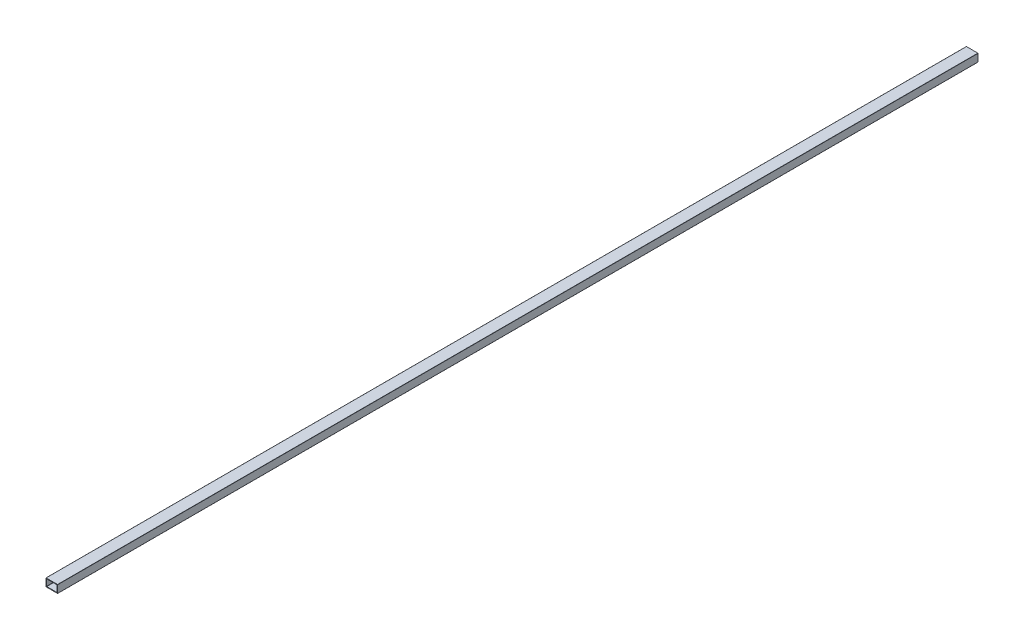
ISO-10303-21;
HEADER;
FILE_DESCRIPTION(('STEP AP214'),'2;1');
FILE_NAME('part.step','',(''),(''),'','','');
FILE_SCHEMA(('AUTOMOTIVE_DESIGN { 1 0 10303 214 1 1 1 1 }'));
ENDSEC;
DATA;
#1=APPLICATION_CONTEXT('core data for automotive mechanical design processes');
#2=APPLICATION_PROTOCOL_DEFINITION('international standard','automotive_design',2000,#1);
#3=PRODUCT_CONTEXT('',#1,'mechanical');
#4=PRODUCT('Part','Part','',(#3));
#5=PRODUCT_RELATED_PRODUCT_CATEGORY('part','',(#4));
#6=PRODUCT_DEFINITION_FORMATION('','',#4);
#7=PRODUCT_DEFINITION_CONTEXT('part definition',#1,'design');
#8=PRODUCT_DEFINITION('design','',#6,#7);
#9=PRODUCT_DEFINITION_SHAPE('','',#8);
#10=(LENGTH_UNIT() NAMED_UNIT(*) SI_UNIT(.MILLI.,.METRE.));
#11=(NAMED_UNIT(*) PLANE_ANGLE_UNIT() SI_UNIT($,.RADIAN.));
#12=(NAMED_UNIT(*) SI_UNIT($,.STERADIAN.) SOLID_ANGLE_UNIT());
#13=UNCERTAINTY_MEASURE_WITH_UNIT(LENGTH_MEASURE(1.E-05),#10,'distance_accuracy_value','');
#14=(GEOMETRIC_REPRESENTATION_CONTEXT(3) GLOBAL_UNCERTAINTY_ASSIGNED_CONTEXT((#13)) GLOBAL_UNIT_ASSIGNED_CONTEXT((#10,
#11,#12)) REPRESENTATION_CONTEXT('',''));
#15=CARTESIAN_POINT('',(0.,0.,0.));
#16=DIRECTION('',(0.,0.,1.));
#17=DIRECTION('',(1.,0.,0.));
#18=AXIS2_PLACEMENT_3D('',#15,#16,#17);
#19=CARTESIAN_POINT('',(38.1,-25.4,-6000.));
#20=DIRECTION('',(1.,0.,0.));
#21=DIRECTION('',(0.,0.,-1.));
#22=AXIS2_PLACEMENT_3D('',#19,#20,#21);
#23=PLANE('',#22);
#24=DIRECTION('',(0.,1.,0.));
#25=VECTOR('',#24,1.);
#26=CARTESIAN_POINT('',(38.1,-25.4,0.));
#27=LINE('',#26,#25);
#28=CARTESIAN_POINT('',(38.1,-24.4,0.));
#29=VERTEX_POINT('',#28);
#30=CARTESIAN_POINT('',(38.1,24.4,0.));
#31=VERTEX_POINT('',#30);
#32=EDGE_CURVE('E197',#29,#31,#27,.T.);
#33=ORIENTED_EDGE('',*,*,#32,.F.);
#34=DIRECTION('',(0.,0.,1.));
#35=VECTOR('',#34,1.);
#36=CARTESIAN_POINT('',(38.1,-24.4,-6000.));
#37=LINE('',#36,#35);
#38=CARTESIAN_POINT('',(38.1,-24.4,-6000.));
#39=VERTEX_POINT('',#38);
#40=EDGE_CURVE('E158',#29,#39,#37,.F.);
#41=ORIENTED_EDGE('',*,*,#40,.T.);
#42=DIRECTION('',(0.,1.,0.));
#43=VECTOR('',#42,1.);
#44=CARTESIAN_POINT('',(38.1,-25.4,-6000.));
#45=LINE('',#44,#43);
#46=CARTESIAN_POINT('',(38.1,24.4,-6000.));
#47=VERTEX_POINT('',#46);
#48=EDGE_CURVE('E185',#39,#47,#45,.T.);
#49=ORIENTED_EDGE('',*,*,#48,.T.);
#50=DIRECTION('',(0.,0.,1.));
#51=VECTOR('',#50,1.);
#52=CARTESIAN_POINT('',(38.1,24.4,-6000.));
#53=LINE('',#52,#51);
#54=EDGE_CURVE('E251',#47,#31,#53,.T.);
#55=ORIENTED_EDGE('',*,*,#54,.T.);
#56=EDGE_LOOP('',(#33,#41,#49,#55));
#57=FACE_BOUND('',#56,.T.);
#58=ADVANCED_FACE('F33',(#57),#23,.T.);
#59=CARTESIAN_POINT('',(-38.1,-25.4,-6000.));
#60=DIRECTION('',(0.,-1.,0.));
#61=DIRECTION('',(0.,0.,-1.));
#62=AXIS2_PLACEMENT_3D('',#59,#60,#61);
#63=PLANE('',#62);
#64=DIRECTION('',(1.,0.,0.));
#65=VECTOR('',#64,1.);
#66=CARTESIAN_POINT('',(-38.1,-25.4,0.));
#67=LINE('',#66,#65);
#68=CARTESIAN_POINT('',(-37.1,-25.4,0.));
#69=VERTEX_POINT('',#68);
#70=CARTESIAN_POINT('',(37.1,-25.4,0.));
#71=VERTEX_POINT('',#70);
#72=EDGE_CURVE('E189',#69,#71,#67,.T.);
#73=ORIENTED_EDGE('',*,*,#72,.F.);
#74=DIRECTION('',(0.,0.,1.));
#75=VECTOR('',#74,1.);
#76=CARTESIAN_POINT('',(-37.1,-25.4,-6000.));
#77=LINE('',#76,#75);
#78=CARTESIAN_POINT('',(-37.1,-25.4,-6000.));
#79=VERTEX_POINT('',#78);
#80=EDGE_CURVE('E238',#69,#79,#77,.F.);
#81=ORIENTED_EDGE('',*,*,#80,.T.);
#82=DIRECTION('',(1.,0.,0.));
#83=VECTOR('',#82,1.);
#84=CARTESIAN_POINT('',(-38.1,-25.4,-6000.));
#85=LINE('',#84,#83);
#86=CARTESIAN_POINT('',(37.1,-25.4,-6000.));
#87=VERTEX_POINT('',#86);
#88=EDGE_CURVE('E194',#79,#87,#85,.T.);
#89=ORIENTED_EDGE('',*,*,#88,.T.);
#90=DIRECTION('',(0.,0.,1.));
#91=VECTOR('',#90,1.);
#92=CARTESIAN_POINT('',(37.1,-25.4,-6000.));
#93=LINE('',#92,#91);
#94=EDGE_CURVE('E235',#87,#71,#93,.T.);
#95=ORIENTED_EDGE('',*,*,#94,.T.);
#96=EDGE_LOOP('',(#73,#81,#89,#95));
#97=FACE_BOUND('',#96,.T.);
#98=ADVANCED_FACE('F305',(#97),#63,.T.);
#99=CARTESIAN_POINT('',(-38.1,-25.4,-6000.));
#100=DIRECTION('',(-1.,0.,0.));
#101=DIRECTION('',(0.,0.,1.));
#102=AXIS2_PLACEMENT_3D('',#99,#100,#101);
#103=PLANE('',#102);
#104=DIRECTION('',(0.,-1.,0.));
#105=VECTOR('',#104,1.);
#106=CARTESIAN_POINT('',(-38.1,-25.4,-6000.));
#107=LINE('',#106,#105);
#108=CARTESIAN_POINT('',(-38.1,24.4,-6000.));
#109=VERTEX_POINT('',#108);
#110=CARTESIAN_POINT('',(-38.1,-24.4,-6000.));
#111=VERTEX_POINT('',#110);
#112=EDGE_CURVE('E191',#109,#111,#107,.T.);
#113=ORIENTED_EDGE('',*,*,#112,.T.);
#114=DIRECTION('',(0.,0.,1.));
#115=VECTOR('',#114,1.);
#116=CARTESIAN_POINT('',(-38.1,-24.4,-6000.));
#117=LINE('',#116,#115);
#118=CARTESIAN_POINT('',(-38.1,-24.4,0.));
#119=VERTEX_POINT('',#118);
#120=EDGE_CURVE('E224',#111,#119,#117,.T.);
#121=ORIENTED_EDGE('',*,*,#120,.T.);
#122=DIRECTION('',(0.,-1.,0.));
#123=VECTOR('',#122,1.);
#124=CARTESIAN_POINT('',(-38.1,-25.4,0.));
#125=LINE('',#124,#123);
#126=CARTESIAN_POINT('',(-38.1,24.4,0.));
#127=VERTEX_POINT('',#126);
#128=EDGE_CURVE('E203',#127,#119,#125,.T.);
#129=ORIENTED_EDGE('',*,*,#128,.F.);
#130=DIRECTION('',(0.,0.,1.));
#131=VECTOR('',#130,1.);
#132=CARTESIAN_POINT('',(-38.1,24.4,-6000.));
#133=LINE('',#132,#131);
#134=EDGE_CURVE('E222',#127,#109,#133,.F.);
#135=ORIENTED_EDGE('',*,*,#134,.T.);
#136=EDGE_LOOP('',(#113,#121,#129,#135));
#137=FACE_BOUND('',#136,.T.);
#138=ADVANCED_FACE('F311',(#137),#103,.T.);
#139=CARTESIAN_POINT('',(-38.1,25.4,-6000.));
#140=DIRECTION('',(0.,1.,0.));
#141=DIRECTION('',(0.,0.,1.));
#142=AXIS2_PLACEMENT_3D('',#139,#140,#141);
#143=PLANE('',#142);
#144=DIRECTION('',(-1.,0.,0.));
#145=VECTOR('',#144,1.);
#146=CARTESIAN_POINT('',(-38.1,25.4,-6000.));
#147=LINE('',#146,#145);
#148=CARTESIAN_POINT('',(37.1,25.4,-6000.));
#149=VERTEX_POINT('',#148);
#150=CARTESIAN_POINT('',(-37.1,25.4,-6000.));
#151=VERTEX_POINT('',#150);
#152=EDGE_CURVE('E188',#149,#151,#147,.T.);
#153=ORIENTED_EDGE('',*,*,#152,.T.);
#154=DIRECTION('',(0.,0.,1.));
#155=VECTOR('',#154,1.);
#156=CARTESIAN_POINT('',(-37.1,25.4,-6000.));
#157=LINE('',#156,#155);
#158=CARTESIAN_POINT('',(-37.1,25.4,0.));
#159=VERTEX_POINT('',#158);
#160=EDGE_CURVE('E248',#151,#159,#157,.T.);
#161=ORIENTED_EDGE('',*,*,#160,.T.);
#162=DIRECTION('',(-1.,0.,0.));
#163=VECTOR('',#162,1.);
#164=CARTESIAN_POINT('',(-38.1,25.4,0.));
#165=LINE('',#164,#163);
#166=CARTESIAN_POINT('',(37.1,25.4,0.));
#167=VERTEX_POINT('',#166);
#168=EDGE_CURVE('E200',#167,#159,#165,.T.);
#169=ORIENTED_EDGE('',*,*,#168,.F.);
#170=DIRECTION('',(0.,0.,1.));
#171=VECTOR('',#170,1.);
#172=CARTESIAN_POINT('',(37.1,25.4,-6000.));
#173=LINE('',#172,#171);
#174=EDGE_CURVE('E55',#167,#149,#173,.F.);
#175=ORIENTED_EDGE('',*,*,#174,.T.);
#176=EDGE_LOOP('',(#153,#161,#169,#175));
#177=FACE_BOUND('',#176,.T.);
#178=ADVANCED_FACE('F316',(#177),#143,.T.);
#179=CARTESIAN_POINT('',(0.,0.,-6000.));
#180=DIRECTION('',(0.,0.,-1.));
#181=DIRECTION('',(-1.,0.,0.));
#182=AXIS2_PLACEMENT_3D('',#179,#180,#181);
#183=PLANE('',#182);
#184=DIRECTION('',(0.,-1.,0.));
#185=VECTOR('',#184,1.);
#186=CARTESIAN_POINT('',(-34.3,-21.6,-6000.));
#187=LINE('',#186,#185);
#188=CARTESIAN_POINT('',(-34.3,20.6,-6000.));
#189=VERTEX_POINT('',#188);
#190=CARTESIAN_POINT('',(-34.3,-20.6,-6000.));
#191=VERTEX_POINT('',#190);
#192=EDGE_CURVE('E167',#189,#191,#187,.T.);
#193=ORIENTED_EDGE('',*,*,#192,.T.);
#194=CARTESIAN_POINT('',(-33.3,-20.6,-6000.));
#195=DIRECTION('',(0.,0.,-1.));
#196=DIRECTION('',(-1.,0.,0.));
#197=AXIS2_PLACEMENT_3D('',#194,#195,#196);
#198=CIRCLE('',#197,1.);
#199=CARTESIAN_POINT('',(-33.3,-21.6,-6000.));
#200=VERTEX_POINT('',#199);
#201=EDGE_CURVE('E11',#191,#200,#198,.F.);
#202=ORIENTED_EDGE('',*,*,#201,.T.);
#203=DIRECTION('',(1.,0.,0.));
#204=VECTOR('',#203,1.);
#205=CARTESIAN_POINT('',(-34.3,-21.6,-6000.));
#206=LINE('',#205,#204);
#207=CARTESIAN_POINT('',(33.3,-21.6,-6000.));
#208=VERTEX_POINT('',#207);
#209=EDGE_CURVE('E175',#200,#208,#206,.T.);
#210=ORIENTED_EDGE('',*,*,#209,.T.);
#211=CARTESIAN_POINT('',(33.3,-20.6,-6000.));
#212=DIRECTION('',(0.,0.,-1.));
#213=DIRECTION('',(-1.,0.,0.));
#214=AXIS2_PLACEMENT_3D('',#211,#212,#213);
#215=CIRCLE('',#214,1.);
#216=CARTESIAN_POINT('',(34.3,-20.6,-6000.));
#217=VERTEX_POINT('',#216);
#218=EDGE_CURVE('E262',#208,#217,#215,.F.);
#219=ORIENTED_EDGE('',*,*,#218,.T.);
#220=DIRECTION('',(0.,1.,0.));
#221=VECTOR('',#220,1.);
#222=CARTESIAN_POINT('',(34.3,-21.6,-6000.));
#223=LINE('',#222,#221);
#224=CARTESIAN_POINT('',(34.3,20.6,-6000.));
#225=VERTEX_POINT('',#224);
#226=EDGE_CURVE('E179',#217,#225,#223,.T.);
#227=ORIENTED_EDGE('',*,*,#226,.T.);
#228=CARTESIAN_POINT('',(33.3,20.6,-6000.));
#229=DIRECTION('',(0.,0.,-1.));
#230=DIRECTION('',(-1.,0.,0.));
#231=AXIS2_PLACEMENT_3D('',#228,#229,#230);
#232=CIRCLE('',#231,1.);
#233=CARTESIAN_POINT('',(33.3,21.6,-6000.));
#234=VERTEX_POINT('',#233);
#235=EDGE_CURVE('E258',#225,#234,#232,.F.);
#236=ORIENTED_EDGE('',*,*,#235,.T.);
#237=DIRECTION('',(-1.,0.,0.));
#238=VECTOR('',#237,1.);
#239=CARTESIAN_POINT('',(-34.3,21.6,-6000.));
#240=LINE('',#239,#238);
#241=CARTESIAN_POINT('',(-33.3,21.6,-6000.));
#242=VERTEX_POINT('',#241);
#243=EDGE_CURVE('E277',#234,#242,#240,.T.);
#244=ORIENTED_EDGE('',*,*,#243,.T.);
#245=CARTESIAN_POINT('',(-33.3,20.6,-6000.));
#246=DIRECTION('',(0.,0.,-1.));
#247=DIRECTION('',(-1.,0.,0.));
#248=AXIS2_PLACEMENT_3D('',#245,#246,#247);
#249=CIRCLE('',#248,1.);
#250=EDGE_CURVE('E157',#242,#189,#249,.F.);
#251=ORIENTED_EDGE('',*,*,#250,.T.);
#252=EDGE_LOOP('',(#193,#202,#210,#219,#227,#236,#244,#251));
#253=FACE_BOUND('',#252,.T.);
#254=ORIENTED_EDGE('',*,*,#88,.F.);
#255=CARTESIAN_POINT('',(-37.1,-24.4,-6000.));
#256=DIRECTION('',(0.,0.,-1.));
#257=DIRECTION('',(-1.,0.,0.));
#258=AXIS2_PLACEMENT_3D('',#255,#256,#257);
#259=CIRCLE('',#258,1.);
#260=EDGE_CURVE('E245',#79,#111,#259,.T.);
#261=ORIENTED_EDGE('',*,*,#260,.T.);
#262=ORIENTED_EDGE('',*,*,#112,.F.);
#263=CARTESIAN_POINT('',(-37.1,24.4,-6000.));
#264=DIRECTION('',(0.,0.,-1.));
#265=DIRECTION('',(-1.,0.,0.));
#266=AXIS2_PLACEMENT_3D('',#263,#264,#265);
#267=CIRCLE('',#266,1.);
#268=EDGE_CURVE('E48',#109,#151,#267,.T.);
#269=ORIENTED_EDGE('',*,*,#268,.T.);
#270=ORIENTED_EDGE('',*,*,#152,.F.);
#271=CARTESIAN_POINT('',(37.1,24.4,-6000.));
#272=DIRECTION('',(0.,0.,-1.));
#273=DIRECTION('',(-1.,0.,0.));
#274=AXIS2_PLACEMENT_3D('',#271,#272,#273);
#275=CIRCLE('',#274,1.);
#276=EDGE_CURVE('E240',#149,#47,#275,.T.);
#277=ORIENTED_EDGE('',*,*,#276,.T.);
#278=ORIENTED_EDGE('',*,*,#48,.F.);
#279=CARTESIAN_POINT('',(37.1,-24.4,-6000.));
#280=DIRECTION('',(0.,0.,-1.));
#281=DIRECTION('',(-1.,0.,0.));
#282=AXIS2_PLACEMENT_3D('',#279,#280,#281);
#283=CIRCLE('',#282,1.);
#284=EDGE_CURVE('E242',#39,#87,#283,.T.);
#285=ORIENTED_EDGE('',*,*,#284,.T.);
#286=EDGE_LOOP('',(#254,#261,#262,#269,#270,#277,#278,#285));
#287=FACE_BOUND('',#286,.T.);
#288=ADVANCED_FACE('F267',(#253,#287),#183,.T.);
#289=CARTESIAN_POINT('',(0.,0.,0.));
#290=DIRECTION('',(0.,0.,-1.));
#291=DIRECTION('',(-1.,0.,0.));
#292=AXIS2_PLACEMENT_3D('',#289,#290,#291);
#293=PLANE('',#292);
#294=DIRECTION('',(0.,1.,0.));
#295=VECTOR('',#294,1.);
#296=CARTESIAN_POINT('',(34.3,-21.6,0.));
#297=LINE('',#296,#295);
#298=CARTESIAN_POINT('',(34.3,-20.6,0.));
#299=VERTEX_POINT('',#298);
#300=CARTESIAN_POINT('',(34.3,20.6,0.));
#301=VERTEX_POINT('',#300);
#302=EDGE_CURVE('E181',#299,#301,#297,.T.);
#303=ORIENTED_EDGE('',*,*,#302,.F.);
#304=CARTESIAN_POINT('',(33.3,-20.6,0.));
#305=DIRECTION('',(0.,0.,-1.));
#306=DIRECTION('',(-1.,0.,0.));
#307=AXIS2_PLACEMENT_3D('',#304,#305,#306);
#308=CIRCLE('',#307,1.);
#309=CARTESIAN_POINT('',(33.3,-21.6,0.));
#310=VERTEX_POINT('',#309);
#311=EDGE_CURVE('E260',#299,#310,#308,.T.);
#312=ORIENTED_EDGE('',*,*,#311,.T.);
#313=DIRECTION('',(1.,0.,0.));
#314=VECTOR('',#313,1.);
#315=CARTESIAN_POINT('',(-34.3,-21.6,0.));
#316=LINE('',#315,#314);
#317=CARTESIAN_POINT('',(-33.3,-21.6,0.));
#318=VERTEX_POINT('',#317);
#319=EDGE_CURVE('E281',#318,#310,#316,.T.);
#320=ORIENTED_EDGE('',*,*,#319,.F.);
#321=CARTESIAN_POINT('',(-33.3,-20.6,0.));
#322=DIRECTION('',(0.,0.,-1.));
#323=DIRECTION('',(-1.,0.,0.));
#324=AXIS2_PLACEMENT_3D('',#321,#322,#323);
#325=CIRCLE('',#324,1.);
#326=CARTESIAN_POINT('',(-34.3,-20.6,0.));
#327=VERTEX_POINT('',#326);
#328=EDGE_CURVE('E41',#318,#327,#325,.T.);
#329=ORIENTED_EDGE('',*,*,#328,.T.);
#330=DIRECTION('',(0.,-1.,0.));
#331=VECTOR('',#330,1.);
#332=CARTESIAN_POINT('',(-34.3,-21.6,0.));
#333=LINE('',#332,#331);
#334=CARTESIAN_POINT('',(-34.3,20.6,0.));
#335=VERTEX_POINT('',#334);
#336=EDGE_CURVE('E164',#335,#327,#333,.T.);
#337=ORIENTED_EDGE('',*,*,#336,.F.);
#338=CARTESIAN_POINT('',(-33.3,20.6,0.));
#339=DIRECTION('',(0.,0.,-1.));
#340=DIRECTION('',(-1.,0.,0.));
#341=AXIS2_PLACEMENT_3D('',#338,#339,#340);
#342=CIRCLE('',#341,1.);
#343=CARTESIAN_POINT('',(-33.3,21.6,0.));
#344=VERTEX_POINT('',#343);
#345=EDGE_CURVE('E147',#335,#344,#342,.T.);
#346=ORIENTED_EDGE('',*,*,#345,.T.);
#347=DIRECTION('',(-1.,0.,0.));
#348=VECTOR('',#347,1.);
#349=CARTESIAN_POINT('',(-34.3,21.6,0.));
#350=LINE('',#349,#348);
#351=CARTESIAN_POINT('',(33.3,21.6,0.));
#352=VERTEX_POINT('',#351);
#353=EDGE_CURVE('E176',#352,#344,#350,.T.);
#354=ORIENTED_EDGE('',*,*,#353,.F.);
#355=CARTESIAN_POINT('',(33.3,20.6,0.));
#356=DIRECTION('',(0.,0.,-1.));
#357=DIRECTION('',(-1.,0.,0.));
#358=AXIS2_PLACEMENT_3D('',#355,#356,#357);
#359=CIRCLE('',#358,1.);
#360=EDGE_CURVE('E256',#352,#301,#359,.T.);
#361=ORIENTED_EDGE('',*,*,#360,.T.);
#362=EDGE_LOOP('',(#303,#312,#320,#329,#337,#346,#354,#361));
#363=FACE_BOUND('',#362,.T.);
#364=ORIENTED_EDGE('',*,*,#128,.T.);
#365=CARTESIAN_POINT('',(-37.1,-24.4,0.));
#366=DIRECTION('',(0.,0.,-1.));
#367=DIRECTION('',(-1.,0.,0.));
#368=AXIS2_PLACEMENT_3D('',#365,#366,#367);
#369=CIRCLE('',#368,1.);
#370=EDGE_CURVE('E233',#119,#69,#369,.F.);
#371=ORIENTED_EDGE('',*,*,#370,.T.);
#372=ORIENTED_EDGE('',*,*,#72,.T.);
#373=CARTESIAN_POINT('',(37.1,-24.4,0.));
#374=DIRECTION('',(0.,0.,-1.));
#375=DIRECTION('',(-1.,0.,0.));
#376=AXIS2_PLACEMENT_3D('',#373,#374,#375);
#377=CIRCLE('',#376,1.);
#378=EDGE_CURVE('E229',#71,#29,#377,.F.);
#379=ORIENTED_EDGE('',*,*,#378,.T.);
#380=ORIENTED_EDGE('',*,*,#32,.T.);
#381=CARTESIAN_POINT('',(37.1,24.4,0.));
#382=DIRECTION('',(0.,0.,-1.));
#383=DIRECTION('',(-1.,0.,0.));
#384=AXIS2_PLACEMENT_3D('',#381,#382,#383);
#385=CIRCLE('',#384,1.);
#386=EDGE_CURVE('E227',#31,#167,#385,.F.);
#387=ORIENTED_EDGE('',*,*,#386,.T.);
#388=ORIENTED_EDGE('',*,*,#168,.T.);
#389=CARTESIAN_POINT('',(-37.1,24.4,0.));
#390=DIRECTION('',(0.,0.,-1.));
#391=DIRECTION('',(-1.,0.,0.));
#392=AXIS2_PLACEMENT_3D('',#389,#390,#391);
#393=CIRCLE('',#392,1.);
#394=EDGE_CURVE('E231',#159,#127,#393,.F.);
#395=ORIENTED_EDGE('',*,*,#394,.T.);
#396=EDGE_LOOP('',(#364,#371,#372,#379,#380,#387,#388,#395));
#397=FACE_BOUND('',#396,.T.);
#398=ADVANCED_FACE('F172',(#363,#397),#293,.F.);
#399=CARTESIAN_POINT('',(-34.3,-21.6,-6000.));
#400=DIRECTION('',(0.,-1.,0.));
#401=DIRECTION('',(0.,0.,-1.));
#402=AXIS2_PLACEMENT_3D('',#399,#400,#401);
#403=PLANE('',#402);
#404=ORIENTED_EDGE('',*,*,#319,.T.);
#405=DIRECTION('',(0.,0.,1.));
#406=VECTOR('',#405,1.);
#407=CARTESIAN_POINT('',(33.3,-21.6,-6000.));
#408=LINE('',#407,#406);
#409=EDGE_CURVE('E220',#310,#208,#408,.F.);
#410=ORIENTED_EDGE('',*,*,#409,.T.);
#411=ORIENTED_EDGE('',*,*,#209,.F.);
#412=DIRECTION('',(0.,0.,1.));
#413=VECTOR('',#412,1.);
#414=CARTESIAN_POINT('',(-33.3,-21.6,0.));
#415=LINE('',#414,#413);
#416=EDGE_CURVE('E217',#200,#318,#415,.T.);
#417=ORIENTED_EDGE('',*,*,#416,.T.);
#418=EDGE_LOOP('',(#404,#410,#411,#417));
#419=FACE_BOUND('',#418,.T.);
#420=ADVANCED_FACE('F283',(#419),#403,.F.);
#421=CARTESIAN_POINT('',(-34.3,-21.6,-6000.));
#422=DIRECTION('',(-1.,0.,0.));
#423=DIRECTION('',(0.,0.,1.));
#424=AXIS2_PLACEMENT_3D('',#421,#422,#423);
#425=PLANE('',#424);
#426=ORIENTED_EDGE('',*,*,#192,.F.);
#427=DIRECTION('',(0.,0.,1.));
#428=VECTOR('',#427,1.);
#429=CARTESIAN_POINT('',(-34.3,20.6,0.));
#430=LINE('',#429,#428);
#431=EDGE_CURVE('E151',#189,#335,#430,.T.);
#432=ORIENTED_EDGE('',*,*,#431,.T.);
#433=ORIENTED_EDGE('',*,*,#336,.T.);
#434=DIRECTION('',(0.,0.,1.));
#435=VECTOR('',#434,1.);
#436=CARTESIAN_POINT('',(-34.3,-20.6,-6000.));
#437=LINE('',#436,#435);
#438=EDGE_CURVE('E169',#327,#191,#437,.F.);
#439=ORIENTED_EDGE('',*,*,#438,.T.);
#440=EDGE_LOOP('',(#426,#432,#433,#439));
#441=FACE_BOUND('',#440,.T.);
#442=ADVANCED_FACE('F163',(#441),#425,.F.);
#443=CARTESIAN_POINT('',(-34.3,21.6,-6000.));
#444=DIRECTION('',(0.,1.,0.));
#445=DIRECTION('',(-1.,0.,0.));
#446=AXIS2_PLACEMENT_3D('',#443,#444,#445);
#447=PLANE('',#446);
#448=ORIENTED_EDGE('',*,*,#353,.T.);
#449=DIRECTION('',(0.,0.,1.));
#450=VECTOR('',#449,1.);
#451=CARTESIAN_POINT('',(-33.3,21.6,-6000.));
#452=LINE('',#451,#450);
#453=EDGE_CURVE('E152',#344,#242,#452,.F.);
#454=ORIENTED_EDGE('',*,*,#453,.T.);
#455=ORIENTED_EDGE('',*,*,#243,.F.);
#456=DIRECTION('',(0.,0.,1.));
#457=VECTOR('',#456,1.);
#458=CARTESIAN_POINT('',(33.3,21.6,0.));
#459=LINE('',#458,#457);
#460=EDGE_CURVE('E168',#234,#352,#459,.T.);
#461=ORIENTED_EDGE('',*,*,#460,.T.);
#462=EDGE_LOOP('',(#448,#454,#455,#461));
#463=FACE_BOUND('',#462,.T.);
#464=ADVANCED_FACE('F292',(#463),#447,.F.);
#465=CARTESIAN_POINT('',(34.3,-21.6,-6000.));
#466=DIRECTION('',(1.,0.,0.));
#467=DIRECTION('',(0.,0.,-1.));
#468=AXIS2_PLACEMENT_3D('',#465,#466,#467);
#469=PLANE('',#468);
#470=ORIENTED_EDGE('',*,*,#302,.T.);
#471=DIRECTION('',(0.,0.,1.));
#472=VECTOR('',#471,1.);
#473=CARTESIAN_POINT('',(34.3,20.6,-6000.));
#474=LINE('',#473,#472);
#475=EDGE_CURVE('E215',#301,#225,#474,.F.);
#476=ORIENTED_EDGE('',*,*,#475,.T.);
#477=ORIENTED_EDGE('',*,*,#226,.F.);
#478=DIRECTION('',(0.,0.,1.));
#479=VECTOR('',#478,1.);
#480=CARTESIAN_POINT('',(34.3,-20.6,0.));
#481=LINE('',#480,#479);
#482=EDGE_CURVE('E212',#217,#299,#481,.T.);
#483=ORIENTED_EDGE('',*,*,#482,.T.);
#484=EDGE_LOOP('',(#470,#476,#477,#483));
#485=FACE_BOUND('',#484,.T.);
#486=ADVANCED_FACE('F275',(#485),#469,.F.);
#487=CARTESIAN_POINT('',(-33.3,20.6,-6000.));
#488=DIRECTION('',(0.,0.,-1.));
#489=DIRECTION('',(-1.,0.,0.));
#490=AXIS2_PLACEMENT_3D('',#487,#488,#489);
#491=CYLINDRICAL_SURFACE('',#490,1.);
#492=ORIENTED_EDGE('',*,*,#250,.F.);
#493=ORIENTED_EDGE('',*,*,#453,.F.);
#494=ORIENTED_EDGE('',*,*,#345,.F.);
#495=ORIENTED_EDGE('',*,*,#431,.F.);
#496=EDGE_LOOP('',(#492,#493,#494,#495));
#497=FACE_BOUND('',#496,.T.);
#498=ADVANCED_FACE('F150',(#497),#491,.F.);
#499=CARTESIAN_POINT('',(33.3,20.6,-6000.));
#500=DIRECTION('',(0.,0.,-1.));
#501=DIRECTION('',(-1.,0.,0.));
#502=AXIS2_PLACEMENT_3D('',#499,#500,#501);
#503=CYLINDRICAL_SURFACE('',#502,1.);
#504=ORIENTED_EDGE('',*,*,#235,.F.);
#505=ORIENTED_EDGE('',*,*,#475,.F.);
#506=ORIENTED_EDGE('',*,*,#360,.F.);
#507=ORIENTED_EDGE('',*,*,#460,.F.);
#508=EDGE_LOOP('',(#504,#505,#506,#507));
#509=FACE_BOUND('',#508,.T.);
#510=ADVANCED_FACE('F294',(#509),#503,.F.);
#511=CARTESIAN_POINT('',(33.3,-20.6,-6000.));
#512=DIRECTION('',(0.,0.,-1.));
#513=DIRECTION('',(-1.,0.,0.));
#514=AXIS2_PLACEMENT_3D('',#511,#512,#513);
#515=CYLINDRICAL_SURFACE('',#514,1.);
#516=ORIENTED_EDGE('',*,*,#218,.F.);
#517=ORIENTED_EDGE('',*,*,#409,.F.);
#518=ORIENTED_EDGE('',*,*,#311,.F.);
#519=ORIENTED_EDGE('',*,*,#482,.F.);
#520=EDGE_LOOP('',(#516,#517,#518,#519));
#521=FACE_BOUND('',#520,.T.);
#522=ADVANCED_FACE('F279',(#521),#515,.F.);
#523=CARTESIAN_POINT('',(-37.1,-24.4,-6000.));
#524=DIRECTION('',(0.,0.,1.));
#525=DIRECTION('',(1.,0.,0.));
#526=AXIS2_PLACEMENT_3D('',#523,#524,#525);
#527=CYLINDRICAL_SURFACE('',#526,1.);
#528=ORIENTED_EDGE('',*,*,#260,.F.);
#529=ORIENTED_EDGE('',*,*,#80,.F.);
#530=ORIENTED_EDGE('',*,*,#370,.F.);
#531=ORIENTED_EDGE('',*,*,#120,.F.);
#532=EDGE_LOOP('',(#528,#529,#530,#531));
#533=FACE_BOUND('',#532,.T.);
#534=ADVANCED_FACE('F301',(#533),#527,.T.);
#535=CARTESIAN_POINT('',(-37.1,24.4,-6000.));
#536=DIRECTION('',(0.,0.,1.));
#537=DIRECTION('',(1.,0.,0.));
#538=AXIS2_PLACEMENT_3D('',#535,#536,#537);
#539=CYLINDRICAL_SURFACE('',#538,1.);
#540=ORIENTED_EDGE('',*,*,#268,.F.);
#541=ORIENTED_EDGE('',*,*,#134,.F.);
#542=ORIENTED_EDGE('',*,*,#394,.F.);
#543=ORIENTED_EDGE('',*,*,#160,.F.);
#544=EDGE_LOOP('',(#540,#541,#542,#543));
#545=FACE_BOUND('',#544,.T.);
#546=ADVANCED_FACE('F368',(#545),#539,.T.);
#547=CARTESIAN_POINT('',(-33.3,-20.6,-6000.));
#548=DIRECTION('',(0.,0.,-1.));
#549=DIRECTION('',(-1.,0.,0.));
#550=AXIS2_PLACEMENT_3D('',#547,#548,#549);
#551=CYLINDRICAL_SURFACE('',#550,1.);
#552=ORIENTED_EDGE('',*,*,#201,.F.);
#553=ORIENTED_EDGE('',*,*,#438,.F.);
#554=ORIENTED_EDGE('',*,*,#328,.F.);
#555=ORIENTED_EDGE('',*,*,#416,.F.);
#556=EDGE_LOOP('',(#552,#553,#554,#555));
#557=FACE_BOUND('',#556,.T.);
#558=ADVANCED_FACE('F378',(#557),#551,.F.);
#559=CARTESIAN_POINT('',(37.1,-24.4,-6000.));
#560=DIRECTION('',(0.,0.,1.));
#561=DIRECTION('',(1.,0.,0.));
#562=AXIS2_PLACEMENT_3D('',#559,#560,#561);
#563=CYLINDRICAL_SURFACE('',#562,1.);
#564=ORIENTED_EDGE('',*,*,#284,.F.);
#565=ORIENTED_EDGE('',*,*,#40,.F.);
#566=ORIENTED_EDGE('',*,*,#378,.F.);
#567=ORIENTED_EDGE('',*,*,#94,.F.);
#568=EDGE_LOOP('',(#564,#565,#566,#567));
#569=FACE_BOUND('',#568,.T.);
#570=ADVANCED_FACE('F388',(#569),#563,.T.);
#571=CARTESIAN_POINT('',(37.1,24.4,-6000.));
#572=DIRECTION('',(0.,0.,1.));
#573=DIRECTION('',(1.,0.,0.));
#574=AXIS2_PLACEMENT_3D('',#571,#572,#573);
#575=CYLINDRICAL_SURFACE('',#574,1.);
#576=ORIENTED_EDGE('',*,*,#276,.F.);
#577=ORIENTED_EDGE('',*,*,#174,.F.);
#578=ORIENTED_EDGE('',*,*,#386,.F.);
#579=ORIENTED_EDGE('',*,*,#54,.F.);
#580=EDGE_LOOP('',(#576,#577,#578,#579));
#581=FACE_BOUND('',#580,.T.);
#582=ADVANCED_FACE('F35',(#581),#575,.T.);
#583=CLOSED_SHELL('',(#58,#98,#138,#178,#288,#398,#420,#442,#464,#486,#498,#510,#522,#534,#546,
#558,#570,#582));
#584=MANIFOLD_SOLID_BREP('B2',#583);
#585=ADVANCED_BREP_SHAPE_REPRESENTATION('',(#18,#584),#14);
#586=SHAPE_DEFINITION_REPRESENTATION(#9,#585);
ENDSEC;
END-ISO-10303-21;
